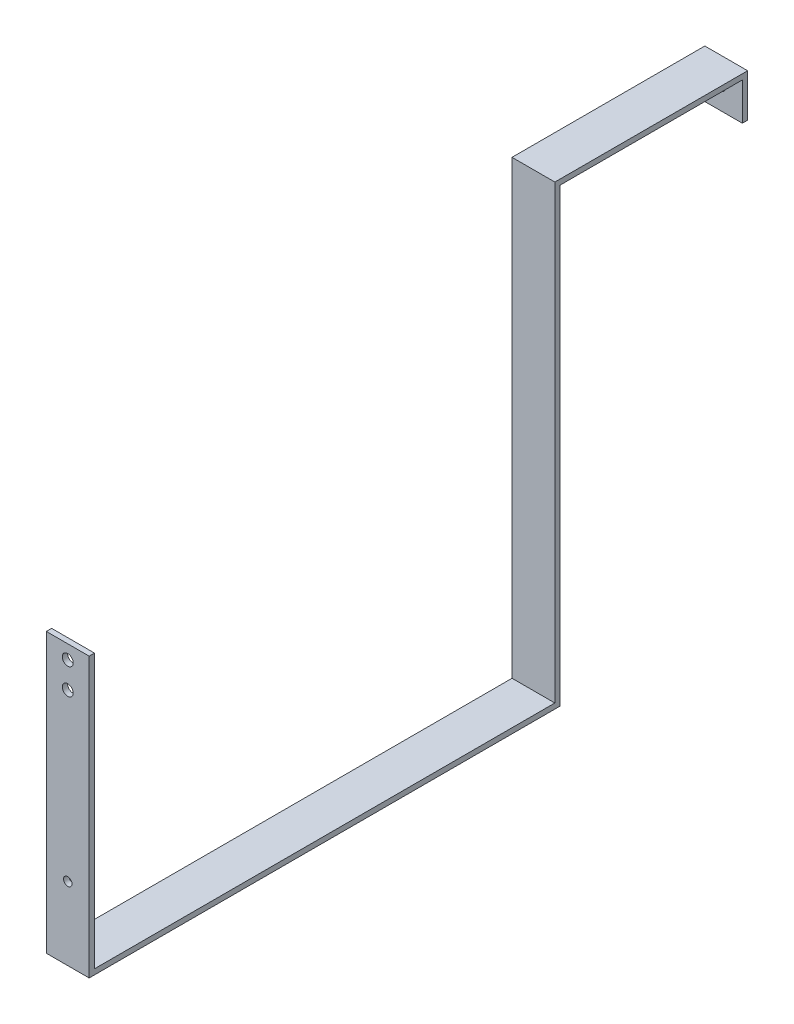
ISO-10303-21;
HEADER;
FILE_DESCRIPTION(('STEP AP214'),'2;1');
FILE_NAME('part.step','',(''),(''),'','','');
FILE_SCHEMA(('AUTOMOTIVE_DESIGN { 1 0 10303 214 1 1 1 1 }'));
ENDSEC;
DATA;
#1=APPLICATION_CONTEXT('core data for automotive mechanical design processes');
#2=APPLICATION_PROTOCOL_DEFINITION('international standard','automotive_design',2000,#1);
#3=PRODUCT_CONTEXT('',#1,'mechanical');
#4=PRODUCT('Part','Part','',(#3));
#5=PRODUCT_RELATED_PRODUCT_CATEGORY('part','',(#4));
#6=PRODUCT_DEFINITION_FORMATION('','',#4);
#7=PRODUCT_DEFINITION_CONTEXT('part definition',#1,'design');
#8=PRODUCT_DEFINITION('design','',#6,#7);
#9=PRODUCT_DEFINITION_SHAPE('','',#8);
#10=(LENGTH_UNIT() NAMED_UNIT(*) SI_UNIT(.MILLI.,.METRE.));
#11=(NAMED_UNIT(*) PLANE_ANGLE_UNIT() SI_UNIT($,.RADIAN.));
#12=(NAMED_UNIT(*) SI_UNIT($,.STERADIAN.) SOLID_ANGLE_UNIT());
#13=UNCERTAINTY_MEASURE_WITH_UNIT(LENGTH_MEASURE(1.E-05),#10,'distance_accuracy_value','');
#14=(GEOMETRIC_REPRESENTATION_CONTEXT(3) GLOBAL_UNCERTAINTY_ASSIGNED_CONTEXT((#13)) GLOBAL_UNIT_ASSIGNED_CONTEXT((#10,
#11,#12)) REPRESENTATION_CONTEXT('',''));
#15=CARTESIAN_POINT('',(0.,0.,0.));
#16=DIRECTION('',(0.,0.,1.));
#17=DIRECTION('',(1.,0.,0.));
#18=AXIS2_PLACEMENT_3D('',#15,#16,#17);
#19=CARTESIAN_POINT('',(25.4,-532.115,781.25));
#20=DIRECTION('',(0.,-1.,0.));
#21=DIRECTION('',(0.,0.,-1.));
#22=AXIS2_PLACEMENT_3D('',#19,#20,#21);
#23=PLANE('',#22);
#24=DIRECTION('',(-1.,0.,0.));
#25=VECTOR('',#24,1.);
#26=CARTESIAN_POINT('',(-25.4,-532.115,774.94));
#27=LINE('',#26,#25);
#28=CARTESIAN_POINT('',(25.4,-532.115,774.94));
#29=VERTEX_POINT('',#28);
#30=CARTESIAN_POINT('',(-25.4,-532.115,774.94));
#31=VERTEX_POINT('',#30);
#32=EDGE_CURVE('E162',#29,#31,#27,.T.);
#33=ORIENTED_EDGE('',*,*,#32,.F.);
#34=DIRECTION('',(0.,0.,-1.));
#35=VECTOR('',#34,1.);
#36=CARTESIAN_POINT('',(25.4,-532.115,781.25));
#37=LINE('',#36,#35);
#38=CARTESIAN_POINT('',(25.4,-532.115,228.75));
#39=VERTEX_POINT('',#38);
#40=EDGE_CURVE('E62',#29,#39,#37,.T.);
#41=ORIENTED_EDGE('',*,*,#40,.T.);
#42=DIRECTION('',(-1.,0.,0.));
#43=VECTOR('',#42,1.);
#44=CARTESIAN_POINT('',(25.4,-532.115,228.75));
#45=LINE('',#44,#43);
#46=CARTESIAN_POINT('',(-25.4,-532.115,228.75));
#47=VERTEX_POINT('',#46);
#48=EDGE_CURVE('E180',#39,#47,#45,.T.);
#49=ORIENTED_EDGE('',*,*,#48,.T.);
#50=DIRECTION('',(0.,0.,-1.));
#51=VECTOR('',#50,1.);
#52=CARTESIAN_POINT('',(-25.4,-532.115,781.25));
#53=LINE('',#52,#51);
#54=EDGE_CURVE('E189',#31,#47,#53,.T.);
#55=ORIENTED_EDGE('',*,*,#54,.F.);
#56=EDGE_LOOP('',(#33,#41,#49,#55));
#57=FACE_BOUND('',#56,.T.);
#58=ADVANCED_FACE('F37',(#57),#23,.F.);
#59=CARTESIAN_POINT('',(0.,0.,228.75));
#60=DIRECTION('',(0.,0.,-1.));
#61=DIRECTION('',(-1.,0.,0.));
#62=AXIS2_PLACEMENT_3D('',#59,#60,#61);
#63=PLANE('',#62);
#64=ORIENTED_EDGE('',*,*,#48,.F.);
#65=DIRECTION('',(0.,1.,0.));
#66=VECTOR('',#65,1.);
#67=CARTESIAN_POINT('',(25.4,-3.155,228.75));
#68=LINE('',#67,#66);
#69=CARTESIAN_POINT('',(25.4,3.155,228.75));
#70=VERTEX_POINT('',#69);
#71=EDGE_CURVE('E209',#39,#70,#68,.T.);
#72=ORIENTED_EDGE('',*,*,#71,.T.);
#73=DIRECTION('',(-1.,0.,0.));
#74=VECTOR('',#73,1.);
#75=CARTESIAN_POINT('',(-25.4,3.155,228.75));
#76=LINE('',#75,#74);
#77=CARTESIAN_POINT('',(-25.4,3.155,228.75));
#78=VERTEX_POINT('',#77);
#79=EDGE_CURVE('E211',#70,#78,#76,.T.);
#80=ORIENTED_EDGE('',*,*,#79,.T.);
#81=DIRECTION('',(0.,-1.,0.));
#82=VECTOR('',#81,1.);
#83=CARTESIAN_POINT('',(-25.4,-3.155,228.75));
#84=LINE('',#83,#82);
#85=EDGE_CURVE('E213',#78,#47,#84,.T.);
#86=ORIENTED_EDGE('',*,*,#85,.T.);
#87=EDGE_LOOP('',(#64,#72,#80,#86));
#88=FACE_BOUND('',#87,.T.);
#89=ADVANCED_FACE('F262',(#88),#63,.F.);
#90=CARTESIAN_POINT('',(-25.4,-3.155,228.75));
#91=DIRECTION('',(0.,1.,0.));
#92=DIRECTION('',(0.,0.,1.));
#93=AXIS2_PLACEMENT_3D('',#90,#91,#92);
#94=PLANE('',#93);
#95=DIRECTION('',(0.,0.,-1.));
#96=VECTOR('',#95,1.);
#97=CARTESIAN_POINT('',(-25.4,-3.155,228.75));
#98=LINE('',#97,#96);
#99=CARTESIAN_POINT('',(-25.4,-3.155,222.44));
#100=VERTEX_POINT('',#99);
#101=CARTESIAN_POINT('',(-25.4,-3.15500000000001,6.31000000000001));
#102=VERTEX_POINT('',#101);
#103=EDGE_CURVE('E225',#100,#102,#98,.T.);
#104=ORIENTED_EDGE('',*,*,#103,.T.);
#105=DIRECTION('',(1.,0.,0.));
#106=VECTOR('',#105,1.);
#107=CARTESIAN_POINT('',(-25.4,-3.155,6.31000000000001));
#108=LINE('',#107,#106);
#109=CARTESIAN_POINT('',(25.4,-3.155,6.31000000000007));
#110=VERTEX_POINT('',#109);
#111=EDGE_CURVE('E131',#102,#110,#108,.T.);
#112=ORIENTED_EDGE('',*,*,#111,.T.);
#113=DIRECTION('',(0.,0.,-1.));
#114=VECTOR('',#113,1.);
#115=CARTESIAN_POINT('',(25.4,-3.155,228.75));
#116=LINE('',#115,#114);
#117=CARTESIAN_POINT('',(25.4,-3.155,222.44));
#118=VERTEX_POINT('',#117);
#119=EDGE_CURVE('E216',#118,#110,#116,.T.);
#120=ORIENTED_EDGE('',*,*,#119,.F.);
#121=DIRECTION('',(1.,0.,0.));
#122=VECTOR('',#121,1.);
#123=CARTESIAN_POINT('',(-25.4,-3.155,222.44));
#124=LINE('',#123,#122);
#125=EDGE_CURVE('E193',#100,#118,#124,.T.);
#126=ORIENTED_EDGE('',*,*,#125,.F.);
#127=EDGE_LOOP('',(#104,#112,#120,#126));
#128=FACE_BOUND('',#127,.T.);
#129=ADVANCED_FACE('F267',(#128),#94,.F.);
#130=CARTESIAN_POINT('',(25.4,-3.155,228.75));
#131=DIRECTION('',(-1.,0.,0.));
#132=DIRECTION('',(0.,0.,1.));
#133=AXIS2_PLACEMENT_3D('',#130,#131,#132);
#134=PLANE('',#133);
#135=ORIENTED_EDGE('',*,*,#119,.T.);
#136=DIRECTION('',(0.,1.,0.));
#137=VECTOR('',#136,1.);
#138=CARTESIAN_POINT('',(25.4,-47.645,6.31));
#139=LINE('',#138,#137);
#140=CARTESIAN_POINT('',(25.4,-47.645,6.31));
#141=VERTEX_POINT('',#140);
#142=EDGE_CURVE('E54',#141,#110,#139,.T.);
#143=ORIENTED_EDGE('',*,*,#142,.F.);
#144=DIRECTION('',(0.,0.,-1.));
#145=VECTOR('',#144,1.);
#146=CARTESIAN_POINT('',(25.4,-47.645,0.));
#147=LINE('',#146,#145);
#148=CARTESIAN_POINT('',(25.4,-47.645,0.));
#149=VERTEX_POINT('',#148);
#150=EDGE_CURVE('E146',#141,#149,#147,.T.);
#151=ORIENTED_EDGE('',*,*,#150,.T.);
#152=DIRECTION('',(0.,1.,0.));
#153=VECTOR('',#152,1.);
#154=CARTESIAN_POINT('',(25.4,-3.155,0.));
#155=LINE('',#154,#153);
#156=CARTESIAN_POINT('',(25.4,3.155,0.));
#157=VERTEX_POINT('',#156);
#158=EDGE_CURVE('E208',#149,#157,#155,.T.);
#159=ORIENTED_EDGE('',*,*,#158,.T.);
#160=DIRECTION('',(0.,0.,-1.));
#161=VECTOR('',#160,1.);
#162=CARTESIAN_POINT('',(25.4,3.155,228.75));
#163=LINE('',#162,#161);
#164=EDGE_CURVE('E11',#70,#157,#163,.T.);
#165=ORIENTED_EDGE('',*,*,#164,.F.);
#166=ORIENTED_EDGE('',*,*,#71,.F.);
#167=ORIENTED_EDGE('',*,*,#40,.F.);
#168=DIRECTION('',(0.,-1.,0.));
#169=VECTOR('',#168,1.);
#170=CARTESIAN_POINT('',(25.4,-207.725,774.94));
#171=LINE('',#170,#169);
#172=CARTESIAN_POINT('',(25.4,-207.725,774.94));
#173=VERTEX_POINT('',#172);
#174=EDGE_CURVE('E178',#173,#29,#171,.T.);
#175=ORIENTED_EDGE('',*,*,#174,.F.);
#176=DIRECTION('',(0.,0.,-1.));
#177=VECTOR('',#176,1.);
#178=CARTESIAN_POINT('',(25.4,-207.725,774.94));
#179=LINE('',#178,#177);
#180=CARTESIAN_POINT('',(25.4,-207.725,781.25));
#181=VERTEX_POINT('',#180);
#182=EDGE_CURVE('E163',#181,#173,#179,.T.);
#183=ORIENTED_EDGE('',*,*,#182,.F.);
#184=DIRECTION('',(0.,1.,0.));
#185=VECTOR('',#184,1.);
#186=CARTESIAN_POINT('',(25.4,-538.425,781.25));
#187=LINE('',#186,#185);
#188=CARTESIAN_POINT('',(25.4,-538.425,781.25));
#189=VERTEX_POINT('',#188);
#190=EDGE_CURVE('E187',#189,#181,#187,.T.);
#191=ORIENTED_EDGE('',*,*,#190,.F.);
#192=DIRECTION('',(0.,0.,1.));
#193=VECTOR('',#192,1.);
#194=CARTESIAN_POINT('',(25.4,-538.425,222.44));
#195=LINE('',#194,#193);
#196=CARTESIAN_POINT('',(25.4,-538.425,222.44));
#197=VERTEX_POINT('',#196);
#198=EDGE_CURVE('E194',#197,#189,#195,.T.);
#199=ORIENTED_EDGE('',*,*,#198,.F.);
#200=DIRECTION('',(0.,1.,0.));
#201=VECTOR('',#200,1.);
#202=CARTESIAN_POINT('',(25.4,-538.425,222.44));
#203=LINE('',#202,#201);
#204=EDGE_CURVE('E200',#197,#118,#203,.T.);
#205=ORIENTED_EDGE('',*,*,#204,.T.);
#206=EDGE_LOOP('',(#135,#143,#151,#159,#165,#166,#167,#175,#183,#191,#199,#205));
#207=FACE_BOUND('',#206,.T.);
#208=ADVANCED_FACE('F39',(#207),#134,.F.);
#209=CARTESIAN_POINT('',(-25.4,3.155,228.75));
#210=DIRECTION('',(0.,-1.,0.));
#211=DIRECTION('',(0.,0.,-1.));
#212=AXIS2_PLACEMENT_3D('',#209,#210,#211);
#213=PLANE('',#212);
#214=ORIENTED_EDGE('',*,*,#164,.T.);
#215=DIRECTION('',(-1.,0.,0.));
#216=VECTOR('',#215,1.);
#217=CARTESIAN_POINT('',(-25.4,3.155,0.));
#218=LINE('',#217,#216);
#219=CARTESIAN_POINT('',(-25.4,3.155,0.));
#220=VERTEX_POINT('',#219);
#221=EDGE_CURVE('E219',#157,#220,#218,.T.);
#222=ORIENTED_EDGE('',*,*,#221,.T.);
#223=DIRECTION('',(0.,0.,-1.));
#224=VECTOR('',#223,1.);
#225=CARTESIAN_POINT('',(-25.4,3.155,228.75));
#226=LINE('',#225,#224);
#227=EDGE_CURVE('E46',#78,#220,#226,.T.);
#228=ORIENTED_EDGE('',*,*,#227,.F.);
#229=ORIENTED_EDGE('',*,*,#79,.F.);
#230=EDGE_LOOP('',(#214,#222,#228,#229));
#231=FACE_BOUND('',#230,.T.);
#232=ADVANCED_FACE('F290',(#231),#213,.F.);
#233=CARTESIAN_POINT('',(-25.4,-3.155,228.75));
#234=DIRECTION('',(1.,0.,0.));
#235=DIRECTION('',(0.,0.,-1.));
#236=AXIS2_PLACEMENT_3D('',#233,#234,#235);
#237=PLANE('',#236);
#238=ORIENTED_EDGE('',*,*,#227,.T.);
#239=DIRECTION('',(0.,-1.,0.));
#240=VECTOR('',#239,1.);
#241=CARTESIAN_POINT('',(-25.4,-3.155,0.));
#242=LINE('',#241,#240);
#243=CARTESIAN_POINT('',(-25.4,-47.645,0.));
#244=VERTEX_POINT('',#243);
#245=EDGE_CURVE('E150',#220,#244,#242,.T.);
#246=ORIENTED_EDGE('',*,*,#245,.T.);
#247=DIRECTION('',(0.,0.,1.));
#248=VECTOR('',#247,1.);
#249=CARTESIAN_POINT('',(-25.4,-47.645,6.31000000000001));
#250=LINE('',#249,#248);
#251=CARTESIAN_POINT('',(-25.4,-47.645,6.31000000000001));
#252=VERTEX_POINT('',#251);
#253=EDGE_CURVE('E143',#244,#252,#250,.T.);
#254=ORIENTED_EDGE('',*,*,#253,.T.);
#255=DIRECTION('',(0.,1.,0.));
#256=VECTOR('',#255,1.);
#257=CARTESIAN_POINT('',(-25.4,-47.645,6.31000000000001));
#258=LINE('',#257,#256);
#259=EDGE_CURVE('E127',#252,#102,#258,.T.);
#260=ORIENTED_EDGE('',*,*,#259,.T.);
#261=ORIENTED_EDGE('',*,*,#103,.F.);
#262=DIRECTION('',(0.,1.,0.));
#263=VECTOR('',#262,1.);
#264=CARTESIAN_POINT('',(-25.4,-538.425,222.44));
#265=LINE('',#264,#263);
#266=CARTESIAN_POINT('',(-25.4,-538.425,222.44));
#267=VERTEX_POINT('',#266);
#268=EDGE_CURVE('E205',#267,#100,#265,.T.);
#269=ORIENTED_EDGE('',*,*,#268,.F.);
#270=DIRECTION('',(0.,0.,-1.));
#271=VECTOR('',#270,1.);
#272=CARTESIAN_POINT('',(-25.4,-538.425,228.75));
#273=LINE('',#272,#271);
#274=CARTESIAN_POINT('',(-25.4,-538.425,781.25));
#275=VERTEX_POINT('',#274);
#276=EDGE_CURVE('E196',#275,#267,#273,.T.);
#277=ORIENTED_EDGE('',*,*,#276,.F.);
#278=DIRECTION('',(0.,-1.,0.));
#279=VECTOR('',#278,1.);
#280=CARTESIAN_POINT('',(-25.4,-532.115,781.25));
#281=LINE('',#280,#279);
#282=CARTESIAN_POINT('',(-25.4,-207.725,781.25));
#283=VERTEX_POINT('',#282);
#284=EDGE_CURVE('E181',#283,#275,#281,.T.);
#285=ORIENTED_EDGE('',*,*,#284,.F.);
#286=DIRECTION('',(0.,0.,1.));
#287=VECTOR('',#286,1.);
#288=CARTESIAN_POINT('',(-25.4,-207.725,781.25));
#289=LINE('',#288,#287);
#290=CARTESIAN_POINT('',(-25.4,-207.725,774.94));
#291=VERTEX_POINT('',#290);
#292=EDGE_CURVE('E168',#291,#283,#289,.T.);
#293=ORIENTED_EDGE('',*,*,#292,.F.);
#294=DIRECTION('',(0.,-1.,0.));
#295=VECTOR('',#294,1.);
#296=CARTESIAN_POINT('',(-25.4,-207.725,774.94));
#297=LINE('',#296,#295);
#298=EDGE_CURVE('E174',#291,#31,#297,.T.);
#299=ORIENTED_EDGE('',*,*,#298,.T.);
#300=ORIENTED_EDGE('',*,*,#54,.T.);
#301=ORIENTED_EDGE('',*,*,#85,.F.);
#302=EDGE_LOOP('',(#238,#246,#254,#260,#261,#269,#277,#285,#293,#299,#300,#301));
#303=FACE_BOUND('',#302,.T.);
#304=ADVANCED_FACE('F148',(#303),#237,.F.);
#305=CARTESIAN_POINT('',(0.,0.,0.));
#306=DIRECTION('',(0.,0.,-1.));
#307=DIRECTION('',(-1.,0.,0.));
#308=AXIS2_PLACEMENT_3D('',#305,#306,#307);
#309=PLANE('',#308);
#310=CARTESIAN_POINT('',(0.,-22.245,0.));
#311=DIRECTION('',(0.,0.,-1.));
#312=DIRECTION('',(-1.,0.,0.));
#313=AXIS2_PLACEMENT_3D('',#310,#311,#312);
#314=CIRCLE('',#313,5.);
#315=CARTESIAN_POINT('',(-5.,-22.245,0.));
#316=VERTEX_POINT('',#315);
#317=EDGE_CURVE('E151',#316,#316,#314,.T.);
#318=ORIENTED_EDGE('',*,*,#317,.F.);
#319=EDGE_LOOP('',(#318));
#320=FACE_BOUND('',#319,.T.);
#321=ORIENTED_EDGE('',*,*,#158,.F.);
#322=DIRECTION('',(-1.,0.,0.));
#323=VECTOR('',#322,1.);
#324=CARTESIAN_POINT('',(-25.4,-47.645,0.));
#325=LINE('',#324,#323);
#326=EDGE_CURVE('E136',#149,#244,#325,.T.);
#327=ORIENTED_EDGE('',*,*,#326,.T.);
#328=ORIENTED_EDGE('',*,*,#245,.F.);
#329=ORIENTED_EDGE('',*,*,#221,.F.);
#330=EDGE_LOOP('',(#321,#327,#328,#329));
#331=FACE_BOUND('',#330,.T.);
#332=ADVANCED_FACE('F280',(#320,#331),#309,.T.);
#333=CARTESIAN_POINT('',(-25.4,-538.425,222.44));
#334=DIRECTION('',(0.,0.,1.));
#335=DIRECTION('',(1.,0.,0.));
#336=AXIS2_PLACEMENT_3D('',#333,#334,#335);
#337=PLANE('',#336);
#338=ORIENTED_EDGE('',*,*,#125,.T.);
#339=ORIENTED_EDGE('',*,*,#204,.F.);
#340=DIRECTION('',(1.,0.,0.));
#341=VECTOR('',#340,1.);
#342=CARTESIAN_POINT('',(-25.4,-538.425,222.44));
#343=LINE('',#342,#341);
#344=EDGE_CURVE('E198',#267,#197,#343,.T.);
#345=ORIENTED_EDGE('',*,*,#344,.F.);
#346=ORIENTED_EDGE('',*,*,#268,.T.);
#347=EDGE_LOOP('',(#338,#339,#345,#346));
#348=FACE_BOUND('',#347,.T.);
#349=ADVANCED_FACE('F277',(#348),#337,.F.);
#350=CARTESIAN_POINT('',(0.,-538.425,0.));
#351=DIRECTION('',(0.,-1.,0.));
#352=DIRECTION('',(0.,0.,-1.));
#353=AXIS2_PLACEMENT_3D('',#350,#351,#352);
#354=PLANE('',#353);
#355=ORIENTED_EDGE('',*,*,#198,.T.);
#356=DIRECTION('',(1.,0.,0.));
#357=VECTOR('',#356,1.);
#358=CARTESIAN_POINT('',(-25.4,-538.425,781.25));
#359=LINE('',#358,#357);
#360=EDGE_CURVE('E184',#275,#189,#359,.T.);
#361=ORIENTED_EDGE('',*,*,#360,.F.);
#362=ORIENTED_EDGE('',*,*,#276,.T.);
#363=ORIENTED_EDGE('',*,*,#344,.T.);
#364=EDGE_LOOP('',(#355,#361,#362,#363));
#365=FACE_BOUND('',#364,.T.);
#366=ADVANCED_FACE('F274',(#365),#354,.T.);
#367=CARTESIAN_POINT('',(0.,0.,781.25));
#368=DIRECTION('',(0.,0.,1.));
#369=DIRECTION('',(1.,0.,0.));
#370=AXIS2_PLACEMENT_3D('',#367,#368,#369);
#371=PLANE('',#370);
#372=CARTESIAN_POINT('',(0.,-451.925,781.25));
#373=DIRECTION('',(0.,0.,1.));
#374=DIRECTION('',(1.,0.,0.));
#375=AXIS2_PLACEMENT_3D('',#372,#373,#374);
#376=CIRCLE('',#375,5.00000000000001);
#377=CARTESIAN_POINT('',(5.00000000000001,-451.925,781.25));
#378=VERTEX_POINT('',#377);
#379=EDGE_CURVE('E243',#378,#378,#376,.T.);
#380=ORIENTED_EDGE('',*,*,#379,.F.);
#381=EDGE_LOOP('',(#380));
#382=FACE_BOUND('',#381,.T.);
#383=CARTESIAN_POINT('',(0.,-255.225,781.25));
#384=DIRECTION('',(0.,0.,1.));
#385=DIRECTION('',(1.,0.,0.));
#386=AXIS2_PLACEMENT_3D('',#383,#384,#385);
#387=CIRCLE('',#386,6.5);
#388=CARTESIAN_POINT('',(6.50000000000001,-255.225,781.25));
#389=VERTEX_POINT('',#388);
#390=EDGE_CURVE('E233',#389,#389,#387,.T.);
#391=ORIENTED_EDGE('',*,*,#390,.F.);
#392=EDGE_LOOP('',(#391));
#393=FACE_BOUND('',#392,.T.);
#394=CARTESIAN_POINT('',(0.,-224.225,781.25));
#395=DIRECTION('',(0.,0.,1.));
#396=DIRECTION('',(1.,0.,0.));
#397=AXIS2_PLACEMENT_3D('',#394,#395,#396);
#398=CIRCLE('',#397,6.5);
#399=CARTESIAN_POINT('',(6.50000000000001,-224.225,781.25));
#400=VERTEX_POINT('',#399);
#401=EDGE_CURVE('E230',#400,#400,#398,.T.);
#402=ORIENTED_EDGE('',*,*,#401,.F.);
#403=EDGE_LOOP('',(#402));
#404=FACE_BOUND('',#403,.T.);
#405=ORIENTED_EDGE('',*,*,#284,.T.);
#406=ORIENTED_EDGE('',*,*,#360,.T.);
#407=ORIENTED_EDGE('',*,*,#190,.T.);
#408=DIRECTION('',(1.,0.,0.));
#409=VECTOR('',#408,1.);
#410=CARTESIAN_POINT('',(25.4,-207.725,781.25));
#411=LINE('',#410,#409);
#412=EDGE_CURVE('E171',#283,#181,#411,.T.);
#413=ORIENTED_EDGE('',*,*,#412,.F.);
#414=EDGE_LOOP('',(#405,#406,#407,#413));
#415=FACE_BOUND('',#414,.T.);
#416=ADVANCED_FACE('F272',(#382,#393,#404,#415),#371,.T.);
#417=CARTESIAN_POINT('',(-25.4,-207.725,774.94));
#418=DIRECTION('',(0.,0.,1.));
#419=DIRECTION('',(1.,0.,0.));
#420=AXIS2_PLACEMENT_3D('',#417,#418,#419);
#421=PLANE('',#420);
#422=CARTESIAN_POINT('',(0.,-451.925,774.94));
#423=DIRECTION('',(0.,0.,1.));
#424=DIRECTION('',(1.,0.,0.));
#425=AXIS2_PLACEMENT_3D('',#422,#423,#424);
#426=CIRCLE('',#425,5.00000000000001);
#427=CARTESIAN_POINT('',(5.00000000000001,-451.925,774.94));
#428=VERTEX_POINT('',#427);
#429=EDGE_CURVE('E41',#428,#428,#426,.T.);
#430=ORIENTED_EDGE('',*,*,#429,.T.);
#431=EDGE_LOOP('',(#430));
#432=FACE_BOUND('',#431,.T.);
#433=CARTESIAN_POINT('',(0.,-255.225,774.94));
#434=DIRECTION('',(0.,0.,1.));
#435=DIRECTION('',(1.,0.,0.));
#436=AXIS2_PLACEMENT_3D('',#433,#434,#435);
#437=CIRCLE('',#436,6.5);
#438=CARTESIAN_POINT('',(6.50000000000001,-255.225,774.94));
#439=VERTEX_POINT('',#438);
#440=EDGE_CURVE('E231',#439,#439,#437,.T.);
#441=ORIENTED_EDGE('',*,*,#440,.T.);
#442=EDGE_LOOP('',(#441));
#443=FACE_BOUND('',#442,.T.);
#444=CARTESIAN_POINT('',(0.,-224.225,774.94));
#445=DIRECTION('',(0.,0.,1.));
#446=DIRECTION('',(1.,0.,0.));
#447=AXIS2_PLACEMENT_3D('',#444,#445,#446);
#448=CIRCLE('',#447,6.5);
#449=CARTESIAN_POINT('',(6.50000000000001,-224.225,774.94));
#450=VERTEX_POINT('',#449);
#451=EDGE_CURVE('E228',#450,#450,#448,.T.);
#452=ORIENTED_EDGE('',*,*,#451,.T.);
#453=EDGE_LOOP('',(#452));
#454=FACE_BOUND('',#453,.T.);
#455=ORIENTED_EDGE('',*,*,#32,.T.);
#456=ORIENTED_EDGE('',*,*,#298,.F.);
#457=DIRECTION('',(-1.,0.,0.));
#458=VECTOR('',#457,1.);
#459=CARTESIAN_POINT('',(-25.4,-207.725,774.94));
#460=LINE('',#459,#458);
#461=EDGE_CURVE('E166',#173,#291,#460,.T.);
#462=ORIENTED_EDGE('',*,*,#461,.F.);
#463=ORIENTED_EDGE('',*,*,#174,.T.);
#464=EDGE_LOOP('',(#455,#456,#462,#463));
#465=FACE_BOUND('',#464,.T.);
#466=ADVANCED_FACE('F258',(#432,#443,#454,#465),#421,.F.);
#467=CARTESIAN_POINT('',(0.,-207.725,0.));
#468=DIRECTION('',(0.,-1.,0.));
#469=DIRECTION('',(0.,0.,-1.));
#470=AXIS2_PLACEMENT_3D('',#467,#468,#469);
#471=PLANE('',#470);
#472=ORIENTED_EDGE('',*,*,#182,.T.);
#473=ORIENTED_EDGE('',*,*,#461,.T.);
#474=ORIENTED_EDGE('',*,*,#292,.T.);
#475=ORIENTED_EDGE('',*,*,#412,.T.);
#476=EDGE_LOOP('',(#472,#473,#474,#475));
#477=FACE_BOUND('',#476,.T.);
#478=ADVANCED_FACE('F251',(#477),#471,.F.);
#479=CARTESIAN_POINT('',(25.4,-47.645,6.31));
#480=DIRECTION('',(0.,0.,1.));
#481=DIRECTION('',(1.,0.,0.));
#482=AXIS2_PLACEMENT_3D('',#479,#480,#481);
#483=PLANE('',#482);
#484=CARTESIAN_POINT('',(0.,-22.245,6.31));
#485=DIRECTION('',(0.,0.,1.));
#486=DIRECTION('',(1.,0.,0.));
#487=AXIS2_PLACEMENT_3D('',#484,#485,#486);
#488=CIRCLE('',#487,5.);
#489=CARTESIAN_POINT('',(5.00000000000001,-22.245,6.31));
#490=VERTEX_POINT('',#489);
#491=EDGE_CURVE('E154',#490,#490,#488,.T.);
#492=ORIENTED_EDGE('',*,*,#491,.F.);
#493=EDGE_LOOP('',(#492));
#494=FACE_BOUND('',#493,.T.);
#495=ORIENTED_EDGE('',*,*,#111,.F.);
#496=ORIENTED_EDGE('',*,*,#259,.F.);
#497=DIRECTION('',(1.,0.,0.));
#498=VECTOR('',#497,1.);
#499=CARTESIAN_POINT('',(25.4,-47.645,6.31));
#500=LINE('',#499,#498);
#501=EDGE_CURVE('E130',#252,#141,#500,.T.);
#502=ORIENTED_EDGE('',*,*,#501,.T.);
#503=ORIENTED_EDGE('',*,*,#142,.T.);
#504=EDGE_LOOP('',(#495,#496,#502,#503));
#505=FACE_BOUND('',#504,.T.);
#506=ADVANCED_FACE('F129',(#494,#505),#483,.T.);
#507=CARTESIAN_POINT('',(0.,-47.645,0.));
#508=DIRECTION('',(0.,-1.,0.));
#509=DIRECTION('',(0.,0.,-1.));
#510=AXIS2_PLACEMENT_3D('',#507,#508,#509);
#511=PLANE('',#510);
#512=ORIENTED_EDGE('',*,*,#253,.F.);
#513=ORIENTED_EDGE('',*,*,#326,.F.);
#514=ORIENTED_EDGE('',*,*,#150,.F.);
#515=ORIENTED_EDGE('',*,*,#501,.F.);
#516=EDGE_LOOP('',(#512,#513,#514,#515));
#517=FACE_BOUND('',#516,.T.);
#518=ADVANCED_FACE('F141',(#517),#511,.T.);
#519=CARTESIAN_POINT('',(0.,-22.245,-409.49));
#520=DIRECTION('',(0.,0.,1.));
#521=DIRECTION('',(1.,0.,0.));
#522=AXIS2_PLACEMENT_3D('',#519,#520,#521);
#523=CYLINDRICAL_SURFACE('',#522,5.);
#524=ORIENTED_EDGE('',*,*,#317,.T.);
#525=EDGE_LOOP('',(#524));
#526=FACE_BOUND('',#525,.T.);
#527=ORIENTED_EDGE('',*,*,#491,.T.);
#528=EDGE_LOOP('',(#527));
#529=FACE_BOUND('',#528,.T.);
#530=ADVANCED_FACE('F248',(#526,#529),#523,.F.);
#531=CARTESIAN_POINT('',(0.,-224.225,771.25));
#532=DIRECTION('',(0.,0.,1.));
#533=DIRECTION('',(1.,0.,0.));
#534=AXIS2_PLACEMENT_3D('',#531,#532,#533);
#535=CYLINDRICAL_SURFACE('',#534,6.5);
#536=ORIENTED_EDGE('',*,*,#401,.T.);
#537=EDGE_LOOP('',(#536));
#538=FACE_BOUND('',#537,.T.);
#539=ORIENTED_EDGE('',*,*,#451,.F.);
#540=EDGE_LOOP('',(#539));
#541=FACE_BOUND('',#540,.T.);
#542=ADVANCED_FACE('F328',(#538,#541),#535,.F.);
#543=CARTESIAN_POINT('',(0.,-255.225,771.25));
#544=DIRECTION('',(0.,0.,1.));
#545=DIRECTION('',(1.,0.,0.));
#546=AXIS2_PLACEMENT_3D('',#543,#544,#545);
#547=CYLINDRICAL_SURFACE('',#546,6.5);
#548=ORIENTED_EDGE('',*,*,#390,.T.);
#549=EDGE_LOOP('',(#548));
#550=FACE_BOUND('',#549,.T.);
#551=ORIENTED_EDGE('',*,*,#440,.F.);
#552=EDGE_LOOP('',(#551));
#553=FACE_BOUND('',#552,.T.);
#554=ADVANCED_FACE('F330',(#550,#553),#547,.F.);
#555=CARTESIAN_POINT('',(0.,-451.925,746.25));
#556=DIRECTION('',(0.,0.,1.));
#557=DIRECTION('',(1.,0.,0.));
#558=AXIS2_PLACEMENT_3D('',#555,#556,#557);
#559=CYLINDRICAL_SURFACE('',#558,5.00000000000001);
#560=ORIENTED_EDGE('',*,*,#379,.T.);
#561=EDGE_LOOP('',(#560));
#562=FACE_BOUND('',#561,.T.);
#563=ORIENTED_EDGE('',*,*,#429,.F.);
#564=EDGE_LOOP('',(#563));
#565=FACE_BOUND('',#564,.T.);
#566=ADVANCED_FACE('F337',(#562,#565),#559,.F.);
#567=CLOSED_SHELL('',(#58,#89,#129,#208,#232,#304,#332,#349,#366,#416,#466,#478,#506,#518,#530,
#542,#554,#566));
#568=MANIFOLD_SOLID_BREP('B2',#567);
#569=ADVANCED_BREP_SHAPE_REPRESENTATION('',(#18,#568),#14);
#570=SHAPE_DEFINITION_REPRESENTATION(#9,#569);
ENDSEC;
END-ISO-10303-21;
